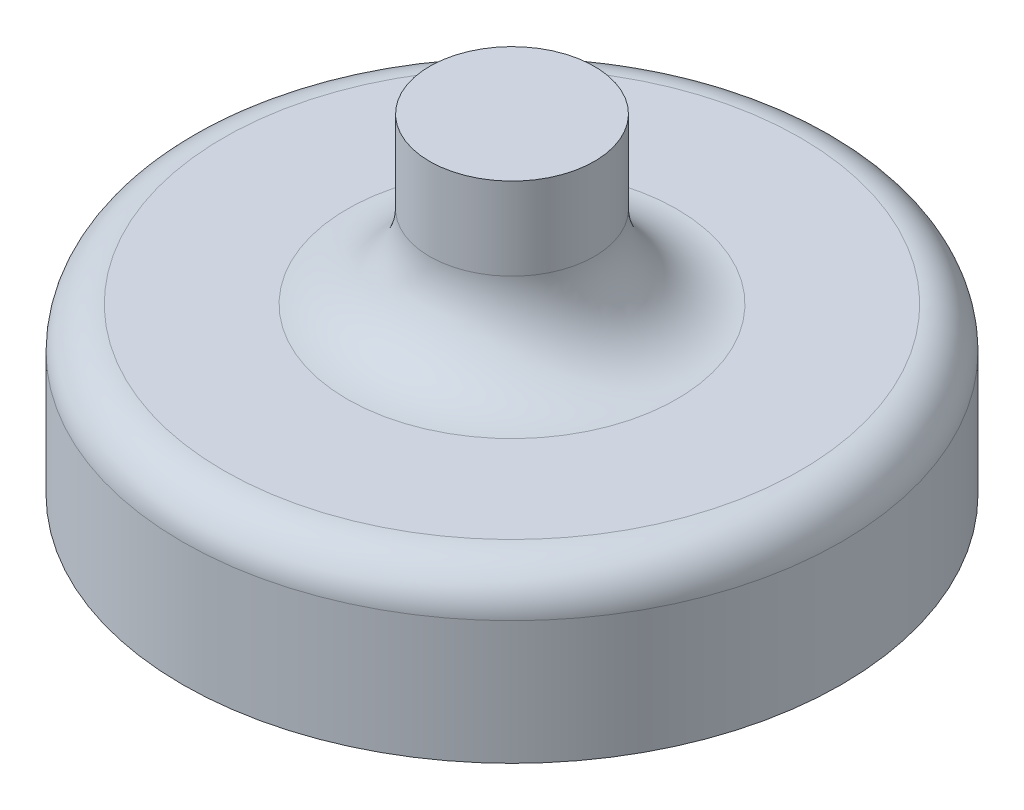
ISO-10303-21;
HEADER;
FILE_DESCRIPTION(('STEP AP214'),'2;1');
FILE_NAME('part.step','',(''),(''),'','','');
FILE_SCHEMA(('AUTOMOTIVE_DESIGN { 1 0 10303 214 1 1 1 1 }'));
ENDSEC;
DATA;
#1=APPLICATION_CONTEXT('core data for automotive mechanical design processes');
#2=APPLICATION_PROTOCOL_DEFINITION('international standard','automotive_design',2000,#1);
#3=PRODUCT_CONTEXT('',#1,'mechanical');
#4=PRODUCT('Part','Part','',(#3));
#5=PRODUCT_RELATED_PRODUCT_CATEGORY('part','',(#4));
#6=PRODUCT_DEFINITION_FORMATION('','',#4);
#7=PRODUCT_DEFINITION_CONTEXT('part definition',#1,'design');
#8=PRODUCT_DEFINITION('design','',#6,#7);
#9=PRODUCT_DEFINITION_SHAPE('','',#8);
#10=(LENGTH_UNIT() NAMED_UNIT(*) SI_UNIT(.MILLI.,.METRE.));
#11=(NAMED_UNIT(*) PLANE_ANGLE_UNIT() SI_UNIT($,.RADIAN.));
#12=(NAMED_UNIT(*) SI_UNIT($,.STERADIAN.) SOLID_ANGLE_UNIT());
#13=UNCERTAINTY_MEASURE_WITH_UNIT(LENGTH_MEASURE(1.E-05),#10,'distance_accuracy_value','');
#14=(GEOMETRIC_REPRESENTATION_CONTEXT(3) GLOBAL_UNCERTAINTY_ASSIGNED_CONTEXT((#13)) GLOBAL_UNIT_ASSIGNED_CONTEXT((#10,
#11,#12)) REPRESENTATION_CONTEXT('',''));
#15=CARTESIAN_POINT('',(0.,0.,0.));
#16=DIRECTION('',(0.,0.,1.));
#17=DIRECTION('',(1.,0.,0.));
#18=AXIS2_PLACEMENT_3D('',#15,#16,#17);
#19=CARTESIAN_POINT('',(0.,25.4,0.));
#20=DIRECTION('',(0.,-1.,0.));
#21=DIRECTION('',(0.,0.,-1.));
#22=AXIS2_PLACEMENT_3D('',#19,#20,#21);
#23=CYLINDRICAL_SURFACE('',#22,50.8);
#24=CARTESIAN_POINT('',(0.,19.05,0.));
#25=DIRECTION('',(0.,1.,0.));
#26=DIRECTION('',(0.,0.,1.));
#27=AXIS2_PLACEMENT_3D('',#24,#25,#26);
#28=CIRCLE('',#27,50.8);
#29=CARTESIAN_POINT('',(0.,19.05,50.8));
#30=VERTEX_POINT('',#29);
#31=EDGE_CURVE('E10',#30,#30,#28,.F.);
#32=ORIENTED_EDGE('',*,*,#31,.T.);
#33=EDGE_LOOP('',(#32));
#34=FACE_BOUND('',#33,.T.);
#35=CARTESIAN_POINT('',(0.,0.,0.));
#36=DIRECTION('',(0.,1.,0.));
#37=DIRECTION('',(0.,0.,1.));
#38=AXIS2_PLACEMENT_3D('',#35,#36,#37);
#39=CIRCLE('',#38,50.8);
#40=CARTESIAN_POINT('',(0.,0.,50.8));
#41=VERTEX_POINT('',#40);
#42=EDGE_CURVE('E73',#41,#41,#39,.T.);
#43=ORIENTED_EDGE('',*,*,#42,.T.);
#44=EDGE_LOOP('',(#43));
#45=FACE_BOUND('',#44,.T.);
#46=ADVANCED_FACE('F49',(#34,#45),#23,.T.);
#47=CARTESIAN_POINT('',(0.,25.4,0.));
#48=DIRECTION('',(0.,1.,0.));
#49=DIRECTION('',(0.,0.,1.));
#50=AXIS2_PLACEMENT_3D('',#47,#48,#49);
#51=PLANE('',#50);
#52=CARTESIAN_POINT('',(0.,25.4,0.));
#53=DIRECTION('',(0.,1.,0.));
#54=DIRECTION('',(0.,0.,1.));
#55=AXIS2_PLACEMENT_3D('',#52,#53,#54);
#56=CIRCLE('',#55,44.45);
#57=CARTESIAN_POINT('',(0.,25.4,44.45));
#58=VERTEX_POINT('',#57);
#59=EDGE_CURVE('E57',#58,#58,#56,.T.);
#60=ORIENTED_EDGE('',*,*,#59,.T.);
#61=EDGE_LOOP('',(#60));
#62=FACE_BOUND('',#61,.T.);
#63=CARTESIAN_POINT('',(0.,25.4,0.));
#64=DIRECTION('',(0.,1.,0.));
#65=DIRECTION('',(0.,0.,1.));
#66=AXIS2_PLACEMENT_3D('',#63,#64,#65);
#67=CIRCLE('',#66,25.4);
#68=CARTESIAN_POINT('',(0.,25.4,25.4));
#69=VERTEX_POINT('',#68);
#70=EDGE_CURVE('E62',#69,#69,#67,.F.);
#71=ORIENTED_EDGE('',*,*,#70,.T.);
#72=EDGE_LOOP('',(#71));
#73=FACE_BOUND('',#72,.T.);
#74=ADVANCED_FACE('F95',(#62,#73),#51,.T.);
#75=CARTESIAN_POINT('',(0.,0.,0.));
#76=DIRECTION('',(0.,1.,0.));
#77=DIRECTION('',(0.,0.,1.));
#78=AXIS2_PLACEMENT_3D('',#75,#76,#77);
#79=PLANE('',#78);
#80=ORIENTED_EDGE('',*,*,#42,.F.);
#81=EDGE_LOOP('',(#80));
#82=FACE_BOUND('',#81,.T.);
#83=ADVANCED_FACE('F86',(#82),#79,.F.);
#84=CARTESIAN_POINT('',(0.,50.8,0.));
#85=DIRECTION('',(0.,-1.,0.));
#86=DIRECTION('',(0.,0.,-1.));
#87=AXIS2_PLACEMENT_3D('',#84,#85,#86);
#88=CYLINDRICAL_SURFACE('',#87,12.7);
#89=CARTESIAN_POINT('',(0.,38.1,0.));
#90=DIRECTION('',(0.,1.,0.));
#91=DIRECTION('',(0.,0.,1.));
#92=AXIS2_PLACEMENT_3D('',#89,#90,#91);
#93=CIRCLE('',#92,12.7);
#94=CARTESIAN_POINT('',(0.,38.1,12.7));
#95=VERTEX_POINT('',#94);
#96=EDGE_CURVE('E67',#95,#95,#93,.T.);
#97=ORIENTED_EDGE('',*,*,#96,.T.);
#98=EDGE_LOOP('',(#97));
#99=FACE_BOUND('',#98,.T.);
#100=CARTESIAN_POINT('',(0.,50.8,0.));
#101=DIRECTION('',(0.,1.,0.));
#102=DIRECTION('',(0.,0.,1.));
#103=AXIS2_PLACEMENT_3D('',#100,#101,#102);
#104=CIRCLE('',#103,12.7);
#105=CARTESIAN_POINT('',(0.,50.8,12.7));
#106=VERTEX_POINT('',#105);
#107=EDGE_CURVE('E77',#106,#106,#104,.T.);
#108=ORIENTED_EDGE('',*,*,#107,.F.);
#109=EDGE_LOOP('',(#108));
#110=FACE_BOUND('',#109,.T.);
#111=ADVANCED_FACE('F84',(#99,#110),#88,.T.);
#112=CARTESIAN_POINT('',(0.,50.8,0.));
#113=DIRECTION('',(0.,1.,0.));
#114=DIRECTION('',(0.,0.,1.));
#115=AXIS2_PLACEMENT_3D('',#112,#113,#114);
#116=PLANE('',#115);
#117=ORIENTED_EDGE('',*,*,#107,.T.);
#118=EDGE_LOOP('',(#117));
#119=FACE_BOUND('',#118,.T.);
#120=ADVANCED_FACE('F82',(#119),#116,.T.);
#121=CARTESIAN_POINT('',(0.,38.1,0.));
#122=DIRECTION('',(0.,1.,0.));
#123=DIRECTION('',(0.,0.,1.));
#124=AXIS2_PLACEMENT_3D('',#121,#122,#123);
#125=TOROIDAL_SURFACE('',#124,25.4,12.7);
#126=ORIENTED_EDGE('',*,*,#70,.F.);
#127=EDGE_LOOP('',(#126));
#128=FACE_BOUND('',#127,.T.);
#129=ORIENTED_EDGE('',*,*,#96,.F.);
#130=EDGE_LOOP('',(#129));
#131=FACE_BOUND('',#130,.T.);
#132=ADVANCED_FACE('F93',(#128,#131),#125,.F.);
#133=CARTESIAN_POINT('',(0.,19.05,0.));
#134=DIRECTION('',(0.,1.,0.));
#135=DIRECTION('',(0.,0.,1.));
#136=AXIS2_PLACEMENT_3D('',#133,#134,#135);
#137=TOROIDAL_SURFACE('',#136,44.45,6.35);
#138=ORIENTED_EDGE('',*,*,#31,.F.);
#139=EDGE_LOOP('',(#138));
#140=FACE_BOUND('',#139,.T.);
#141=ORIENTED_EDGE('',*,*,#59,.F.);
#142=EDGE_LOOP('',(#141));
#143=FACE_BOUND('',#142,.T.);
#144=ADVANCED_FACE('F51',(#140,#143),#137,.T.);
#145=CLOSED_SHELL('',(#46,#74,#83,#111,#120,#132,#144));
#146=MANIFOLD_SOLID_BREP('B2',#145);
#147=ADVANCED_BREP_SHAPE_REPRESENTATION('',(#18,#146),#14);
#148=SHAPE_DEFINITION_REPRESENTATION(#9,#147);
ENDSEC;
END-ISO-10303-21;
